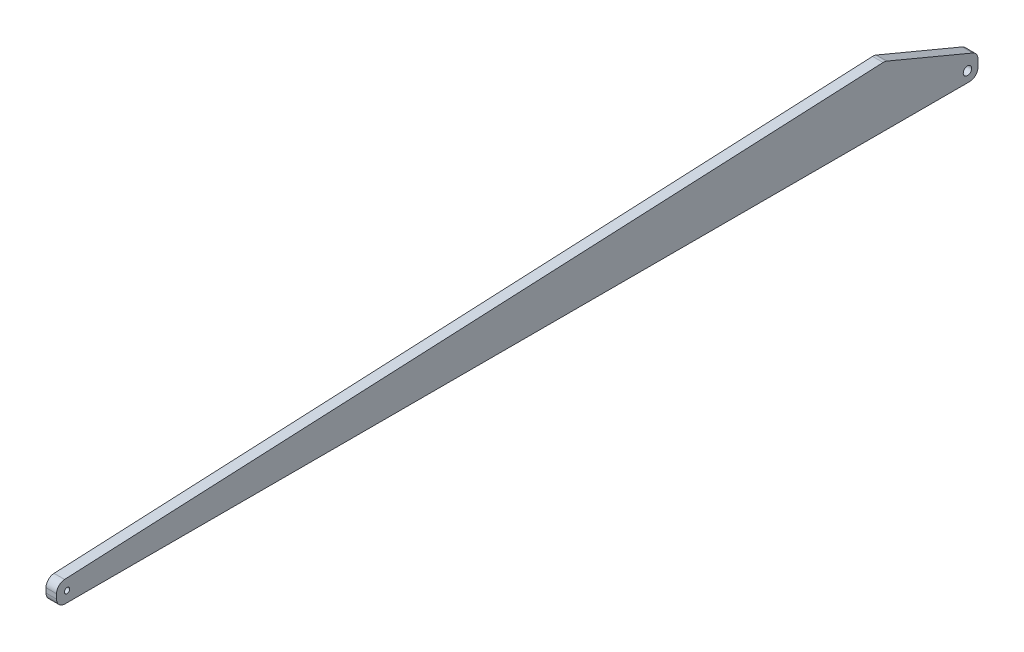
ISO-10303-21;
HEADER;
FILE_DESCRIPTION(('STEP AP214'),'2;1');
FILE_NAME('part.step','',(''),(''),'','','');
FILE_SCHEMA(('AUTOMOTIVE_DESIGN { 1 0 10303 214 1 1 1 1 }'));
ENDSEC;
DATA;
#1=APPLICATION_CONTEXT('core data for automotive mechanical design processes');
#2=APPLICATION_PROTOCOL_DEFINITION('international standard','automotive_design',2000,#1);
#3=PRODUCT_CONTEXT('',#1,'mechanical');
#4=PRODUCT('Part','Part','',(#3));
#5=PRODUCT_RELATED_PRODUCT_CATEGORY('part','',(#4));
#6=PRODUCT_DEFINITION_FORMATION('','',#4);
#7=PRODUCT_DEFINITION_CONTEXT('part definition',#1,'design');
#8=PRODUCT_DEFINITION('design','',#6,#7);
#9=PRODUCT_DEFINITION_SHAPE('','',#8);
#10=(LENGTH_UNIT() NAMED_UNIT(*) SI_UNIT(.MILLI.,.METRE.));
#11=(NAMED_UNIT(*) PLANE_ANGLE_UNIT() SI_UNIT($,.RADIAN.));
#12=(NAMED_UNIT(*) SI_UNIT($,.STERADIAN.) SOLID_ANGLE_UNIT());
#13=UNCERTAINTY_MEASURE_WITH_UNIT(LENGTH_MEASURE(1.E-05),#10,'distance_accuracy_value','');
#14=(GEOMETRIC_REPRESENTATION_CONTEXT(3) GLOBAL_UNCERTAINTY_ASSIGNED_CONTEXT((#13)) GLOBAL_UNIT_ASSIGNED_CONTEXT((#10,
#11,#12)) REPRESENTATION_CONTEXT('',''));
#15=CARTESIAN_POINT('',(0.,0.,0.));
#16=DIRECTION('',(0.,0.,1.));
#17=DIRECTION('',(1.,0.,0.));
#18=AXIS2_PLACEMENT_3D('',#15,#16,#17);
#19=CARTESIAN_POINT('',(6.35,0.,0.));
#20=DIRECTION('',(1.,0.,0.));
#21=DIRECTION('',(0.,0.,-1.));
#22=AXIS2_PLACEMENT_3D('',#19,#20,#21);
#23=PLANE('',#22);
#24=CARTESIAN_POINT('',(6.35,6.35,271.399));
#25=DIRECTION('',(1.,0.,0.));
#26=DIRECTION('',(0.,0.,-1.));
#27=AXIS2_PLACEMENT_3D('',#24,#25,#26);
#28=CIRCLE('',#27,1.60020000000001);
#29=CARTESIAN_POINT('',(6.35,6.35,269.7988));
#30=VERTEX_POINT('',#29);
#31=EDGE_CURVE('E154',#30,#30,#28,.T.);
#32=ORIENTED_EDGE('',*,*,#31,.F.);
#33=EDGE_LOOP('',(#32));
#34=FACE_BOUND('',#33,.T.);
#35=DIRECTION('',(0.,0.,-1.));
#36=VECTOR('',#35,1.);
#37=CARTESIAN_POINT('',(6.35,0.,-265.049));
#38=LINE('',#37,#36);
#39=CARTESIAN_POINT('',(6.35,4.21024326513475E-12,272.669));
#40=VERTEX_POINT('',#39);
#41=CARTESIAN_POINT('',(6.35,0.,-272.669));
#42=VERTEX_POINT('',#41);
#43=EDGE_CURVE('E177',#40,#42,#38,.T.);
#44=ORIENTED_EDGE('',*,*,#43,.T.);
#45=CARTESIAN_POINT('',(6.35,5.0800000000001,-272.669));
#46=DIRECTION('',(1.,0.,0.));
#47=DIRECTION('',(0.,0.,-1.));
#48=AXIS2_PLACEMENT_3D('',#45,#46,#47);
#49=CIRCLE('',#48,5.08);
#50=CARTESIAN_POINT('',(6.35,5.0800000000001,-277.749));
#51=VERTEX_POINT('',#50);
#52=EDGE_CURVE('E206',#42,#51,#49,.T.);
#53=ORIENTED_EDGE('',*,*,#52,.T.);
#54=DIRECTION('',(0.,1.,0.));
#55=VECTOR('',#54,1.);
#56=CARTESIAN_POINT('',(6.35,0.,-277.749));
#57=LINE('',#56,#55);
#58=CARTESIAN_POINT('',(6.35,9.31858027338978,-277.749));
#59=VERTEX_POINT('',#58);
#60=EDGE_CURVE('E144',#51,#59,#57,.T.);
#61=ORIENTED_EDGE('',*,*,#60,.T.);
#62=CARTESIAN_POINT('',(6.35,9.31858027338978,-272.669));
#63=DIRECTION('',(1.,0.,0.));
#64=DIRECTION('',(0.,0.,-1.));
#65=AXIS2_PLACEMENT_3D('',#62,#63,#64);
#66=CIRCLE('',#65,5.08);
#67=CARTESIAN_POINT('',(6.35,14.0050106830984,-274.629553497092));
#68=VERTEX_POINT('',#67);
#69=EDGE_CURVE('E203',#59,#68,#66,.T.);
#70=ORIENTED_EDGE('',*,*,#69,.T.);
#71=DIRECTION('',(0.,0.385935727773932,0.922525671202491));
#72=VECTOR('',#71,1.);
#73=CARTESIAN_POINT('',(6.35,36.1531263969552,-221.687563822674));
#74=LINE('',#73,#72);
#75=CARTESIAN_POINT('',(6.35,35.711468615602,-222.743285311677));
#76=VERTEX_POINT('',#75);
#77=EDGE_CURVE('E240',#68,#76,#74,.T.);
#78=ORIENTED_EDGE('',*,*,#77,.T.);
#79=CARTESIAN_POINT('',(6.35,31.0250382058933,-220.782731814585));
#80=DIRECTION('',(1.,0.,0.));
#81=DIRECTION('',(0.,0.,-1.));
#82=AXIS2_PLACEMENT_3D('',#79,#80,#81);
#83=CIRCLE('',#82,5.08);
#84=CARTESIAN_POINT('',(6.35,36.0994463368233,-220.544441821611));
#85=VERTEX_POINT('',#84);
#86=EDGE_CURVE('E200',#76,#85,#83,.T.);
#87=ORIENTED_EDGE('',*,*,#86,.T.);
#88=DIRECTION('',(0.,-0.0469074789319585,0.998899238372043));
#89=VECTOR('',#88,1.);
#90=CARTESIAN_POINT('',(6.35,12.7,277.749));
#91=LINE('',#90,#89);
#92=CARTESIAN_POINT('',(6.35,12.9273626822655,272.907289992974));
#93=VERTEX_POINT('',#92);
#94=EDGE_CURVE('E246',#85,#93,#91,.T.);
#95=ORIENTED_EDGE('',*,*,#94,.T.);
#96=CARTESIAN_POINT('',(6.35,7.85295455133549,272.669));
#97=DIRECTION('',(1.,0.,0.));
#98=DIRECTION('',(0.,0.,-1.));
#99=AXIS2_PLACEMENT_3D('',#96,#97,#98);
#100=CIRCLE('',#99,5.08);
#101=CARTESIAN_POINT('',(6.35,7.85295455133549,277.749));
#102=VERTEX_POINT('',#101);
#103=EDGE_CURVE('E66',#93,#102,#100,.T.);
#104=ORIENTED_EDGE('',*,*,#103,.T.);
#105=DIRECTION('',(0.,-1.,0.));
#106=VECTOR('',#105,1.);
#107=CARTESIAN_POINT('',(6.35,0.,277.749));
#108=LINE('',#107,#106);
#109=CARTESIAN_POINT('',(6.35,5.08,277.749));
#110=VERTEX_POINT('',#109);
#111=EDGE_CURVE('E165',#102,#110,#108,.T.);
#112=ORIENTED_EDGE('',*,*,#111,.T.);
#113=CARTESIAN_POINT('',(6.35,5.08,272.669));
#114=DIRECTION('',(1.,0.,0.));
#115=DIRECTION('',(0.,0.,-1.));
#116=AXIS2_PLACEMENT_3D('',#113,#114,#115);
#117=CIRCLE('',#116,5.08);
#118=EDGE_CURVE('E197',#110,#40,#117,.T.);
#119=ORIENTED_EDGE('',*,*,#118,.T.);
#120=EDGE_LOOP('',(#44,#53,#61,#70,#78,#87,#95,#104,#112,#119));
#121=FACE_BOUND('',#120,.T.);
#122=CARTESIAN_POINT('',(6.35,6.35,-271.399));
#123=DIRECTION('',(1.,0.,0.));
#124=DIRECTION('',(0.,0.,-1.));
#125=AXIS2_PLACEMENT_3D('',#122,#123,#124);
#126=CIRCLE('',#125,2.55270000000004);
#127=CARTESIAN_POINT('',(6.35,6.35,-273.9517));
#128=VERTEX_POINT('',#127);
#129=EDGE_CURVE('E256',#128,#128,#126,.T.);
#130=ORIENTED_EDGE('',*,*,#129,.F.);
#131=EDGE_LOOP('',(#130));
#132=FACE_BOUND('',#131,.T.);
#133=ADVANCED_FACE('F45',(#34,#121,#132),#23,.T.);
#134=CARTESIAN_POINT('',(0.,0.,0.));
#135=DIRECTION('',(1.,0.,0.));
#136=DIRECTION('',(0.,0.,-1.));
#137=AXIS2_PLACEMENT_3D('',#134,#135,#136);
#138=PLANE('',#137);
#139=DIRECTION('',(0.,1.,0.));
#140=VECTOR('',#139,1.);
#141=CARTESIAN_POINT('',(0.,0.,-277.749));
#142=LINE('',#141,#140);
#143=CARTESIAN_POINT('',(0.,5.0800000000001,-277.749));
#144=VERTEX_POINT('',#143);
#145=CARTESIAN_POINT('',(0.,9.31858027338978,-277.749));
#146=VERTEX_POINT('',#145);
#147=EDGE_CURVE('E141',#144,#146,#142,.T.);
#148=ORIENTED_EDGE('',*,*,#147,.F.);
#149=CARTESIAN_POINT('',(0.,5.0800000000001,-272.669));
#150=DIRECTION('',(1.,0.,0.));
#151=DIRECTION('',(0.,0.,-1.));
#152=AXIS2_PLACEMENT_3D('',#149,#150,#151);
#153=CIRCLE('',#152,5.08);
#154=CARTESIAN_POINT('',(0.,0.,-272.669));
#155=VERTEX_POINT('',#154);
#156=EDGE_CURVE('E123',#144,#155,#153,.F.);
#157=ORIENTED_EDGE('',*,*,#156,.T.);
#158=DIRECTION('',(0.,0.,-1.));
#159=VECTOR('',#158,1.);
#160=CARTESIAN_POINT('',(0.,0.,265.049));
#161=LINE('',#160,#159);
#162=CARTESIAN_POINT('',(0.,0.,272.669));
#163=VERTEX_POINT('',#162);
#164=EDGE_CURVE('E174',#163,#155,#161,.T.);
#165=ORIENTED_EDGE('',*,*,#164,.F.);
#166=CARTESIAN_POINT('',(0.,5.08,272.669));
#167=DIRECTION('',(1.,0.,0.));
#168=DIRECTION('',(0.,0.,-1.));
#169=AXIS2_PLACEMENT_3D('',#166,#167,#168);
#170=CIRCLE('',#169,5.08);
#171=CARTESIAN_POINT('',(0.,5.08,277.749));
#172=VERTEX_POINT('',#171);
#173=EDGE_CURVE('E182',#163,#172,#170,.F.);
#174=ORIENTED_EDGE('',*,*,#173,.T.);
#175=DIRECTION('',(0.,-1.,0.));
#176=VECTOR('',#175,1.);
#177=CARTESIAN_POINT('',(0.,0.,277.749));
#178=LINE('',#177,#176);
#179=CARTESIAN_POINT('',(0.,7.85295455133549,277.749));
#180=VERTEX_POINT('',#179);
#181=EDGE_CURVE('E171',#180,#172,#178,.T.);
#182=ORIENTED_EDGE('',*,*,#181,.F.);
#183=CARTESIAN_POINT('',(0.,7.85295455133549,272.669));
#184=DIRECTION('',(1.,0.,0.));
#185=DIRECTION('',(0.,0.,-1.));
#186=AXIS2_PLACEMENT_3D('',#183,#184,#185);
#187=CIRCLE('',#186,5.08);
#188=CARTESIAN_POINT('',(0.,12.9273626822655,272.907289992974));
#189=VERTEX_POINT('',#188);
#190=EDGE_CURVE('E146',#180,#189,#187,.F.);
#191=ORIENTED_EDGE('',*,*,#190,.T.);
#192=DIRECTION('',(0.,-0.0469074789319585,0.998899238372043));
#193=VECTOR('',#192,1.);
#194=CARTESIAN_POINT('',(0.,12.7,277.749));
#195=LINE('',#194,#193);
#196=CARTESIAN_POINT('',(0.,36.0994463368233,-220.544441821611));
#197=VERTEX_POINT('',#196);
#198=EDGE_CURVE('E159',#197,#189,#195,.T.);
#199=ORIENTED_EDGE('',*,*,#198,.F.);
#200=CARTESIAN_POINT('',(0.,31.0250382058933,-220.782731814585));
#201=DIRECTION('',(1.,0.,0.));
#202=DIRECTION('',(0.,0.,-1.));
#203=AXIS2_PLACEMENT_3D('',#200,#201,#202);
#204=CIRCLE('',#203,5.08);
#205=CARTESIAN_POINT('',(0.,35.711468615602,-222.743285311677));
#206=VERTEX_POINT('',#205);
#207=EDGE_CURVE('E185',#197,#206,#204,.F.);
#208=ORIENTED_EDGE('',*,*,#207,.T.);
#209=DIRECTION('',(0.,0.385935727773932,0.922525671202491));
#210=VECTOR('',#209,1.);
#211=CARTESIAN_POINT('',(0.,36.1531263969552,-221.687563822674));
#212=LINE('',#211,#210);
#213=CARTESIAN_POINT('',(0.,14.0050106830984,-274.629553497092));
#214=VERTEX_POINT('',#213);
#215=EDGE_CURVE('E153',#214,#206,#212,.T.);
#216=ORIENTED_EDGE('',*,*,#215,.F.);
#217=CARTESIAN_POINT('',(0.,9.31858027338978,-272.669));
#218=DIRECTION('',(1.,0.,0.));
#219=DIRECTION('',(0.,0.,-1.));
#220=AXIS2_PLACEMENT_3D('',#217,#218,#219);
#221=CIRCLE('',#220,5.08);
#222=EDGE_CURVE('E135',#214,#146,#221,.F.);
#223=ORIENTED_EDGE('',*,*,#222,.T.);
#224=EDGE_LOOP('',(#148,#157,#165,#174,#182,#191,#199,#208,#216,#223));
#225=FACE_BOUND('',#224,.T.);
#226=CARTESIAN_POINT('',(0.,6.35,271.399));
#227=DIRECTION('',(1.,0.,0.));
#228=DIRECTION('',(0.,0.,-1.));
#229=AXIS2_PLACEMENT_3D('',#226,#227,#228);
#230=CIRCLE('',#229,1.60020000000001);
#231=CARTESIAN_POINT('',(0.,6.35,269.7988));
#232=VERTEX_POINT('',#231);
#233=EDGE_CURVE('E162',#232,#232,#230,.T.);
#234=ORIENTED_EDGE('',*,*,#233,.T.);
#235=EDGE_LOOP('',(#234));
#236=FACE_BOUND('',#235,.T.);
#237=CARTESIAN_POINT('',(0.,6.35,-271.399));
#238=DIRECTION('',(1.,0.,0.));
#239=DIRECTION('',(0.,0.,-1.));
#240=AXIS2_PLACEMENT_3D('',#237,#238,#239);
#241=CIRCLE('',#240,2.55270000000004);
#242=CARTESIAN_POINT('',(0.,6.35,-273.9517));
#243=VERTEX_POINT('',#242);
#244=EDGE_CURVE('E259',#243,#243,#241,.T.);
#245=ORIENTED_EDGE('',*,*,#244,.T.);
#246=EDGE_LOOP('',(#245));
#247=FACE_BOUND('',#246,.T.);
#248=ADVANCED_FACE('F149',(#225,#236,#247),#138,.F.);
#249=CARTESIAN_POINT('',(6.35,0.,-277.749));
#250=DIRECTION('',(0.,0.,1.));
#251=DIRECTION('',(1.,0.,0.));
#252=AXIS2_PLACEMENT_3D('',#249,#250,#251);
#253=PLANE('',#252);
#254=ORIENTED_EDGE('',*,*,#60,.F.);
#255=DIRECTION('',(-1.,0.,0.));
#256=VECTOR('',#255,1.);
#257=CARTESIAN_POINT('',(6.35,5.0800000000001,-277.749));
#258=LINE('',#257,#256);
#259=EDGE_CURVE('E127',#51,#144,#258,.T.);
#260=ORIENTED_EDGE('',*,*,#259,.T.);
#261=ORIENTED_EDGE('',*,*,#147,.T.);
#262=DIRECTION('',(-1.,0.,0.));
#263=VECTOR('',#262,1.);
#264=CARTESIAN_POINT('',(6.35,9.31858027338978,-277.749));
#265=LINE('',#264,#263);
#266=EDGE_CURVE('E147',#146,#59,#265,.F.);
#267=ORIENTED_EDGE('',*,*,#266,.T.);
#268=EDGE_LOOP('',(#254,#260,#261,#267));
#269=FACE_BOUND('',#268,.T.);
#270=ADVANCED_FACE('F140',(#269),#253,.F.);
#271=CARTESIAN_POINT('',(6.35,36.1531263969552,-221.687563822674));
#272=DIRECTION('',(0.,-0.922525671202491,0.385935727773932));
#273=DIRECTION('',(0.,-0.385935727773932,-0.922525671202491));
#274=AXIS2_PLACEMENT_3D('',#271,#272,#273);
#275=PLANE('',#274);
#276=ORIENTED_EDGE('',*,*,#77,.F.);
#277=DIRECTION('',(-1.,0.,0.));
#278=VECTOR('',#277,1.);
#279=CARTESIAN_POINT('',(6.35,14.0050106830984,-274.629553497092));
#280=LINE('',#279,#278);
#281=EDGE_CURVE('E212',#68,#214,#280,.T.);
#282=ORIENTED_EDGE('',*,*,#281,.T.);
#283=ORIENTED_EDGE('',*,*,#215,.T.);
#284=DIRECTION('',(-1.,0.,0.));
#285=VECTOR('',#284,1.);
#286=CARTESIAN_POINT('',(6.35,35.711468615602,-222.743285311677));
#287=LINE('',#286,#285);
#288=EDGE_CURVE('E209',#206,#76,#287,.F.);
#289=ORIENTED_EDGE('',*,*,#288,.T.);
#290=EDGE_LOOP('',(#276,#282,#283,#289));
#291=FACE_BOUND('',#290,.T.);
#292=ADVANCED_FACE('F291',(#291),#275,.F.);
#293=CARTESIAN_POINT('',(6.35,12.7,277.749));
#294=DIRECTION('',(0.,-0.998899238372043,-0.0469074789319585));
#295=DIRECTION('',(0.,0.0469074789319585,-0.998899238372043));
#296=AXIS2_PLACEMENT_3D('',#293,#294,#295);
#297=PLANE('',#296);
#298=ORIENTED_EDGE('',*,*,#94,.F.);
#299=DIRECTION('',(-1.,0.,0.));
#300=VECTOR('',#299,1.);
#301=CARTESIAN_POINT('',(6.35,36.0994463368233,-220.544441821611));
#302=LINE('',#301,#300);
#303=EDGE_CURVE('E219',#85,#197,#302,.T.);
#304=ORIENTED_EDGE('',*,*,#303,.T.);
#305=ORIENTED_EDGE('',*,*,#198,.T.);
#306=DIRECTION('',(-1.,0.,0.));
#307=VECTOR('',#306,1.);
#308=CARTESIAN_POINT('',(6.35,12.9273626822655,272.907289992974));
#309=LINE('',#308,#307);
#310=EDGE_CURVE('E216',#189,#93,#309,.F.);
#311=ORIENTED_EDGE('',*,*,#310,.T.);
#312=EDGE_LOOP('',(#298,#304,#305,#311));
#313=FACE_BOUND('',#312,.T.);
#314=ADVANCED_FACE('F288',(#313),#297,.F.);
#315=CARTESIAN_POINT('',(6.35,0.,277.749));
#316=DIRECTION('',(0.,0.,-1.));
#317=DIRECTION('',(-1.,0.,0.));
#318=AXIS2_PLACEMENT_3D('',#315,#316,#317);
#319=PLANE('',#318);
#320=ORIENTED_EDGE('',*,*,#181,.T.);
#321=DIRECTION('',(-1.,0.,0.));
#322=VECTOR('',#321,1.);
#323=CARTESIAN_POINT('',(6.35,5.08,277.749));
#324=LINE('',#323,#322);
#325=EDGE_CURVE('E11',#172,#110,#324,.F.);
#326=ORIENTED_EDGE('',*,*,#325,.T.);
#327=ORIENTED_EDGE('',*,*,#111,.F.);
#328=DIRECTION('',(-1.,0.,0.));
#329=VECTOR('',#328,1.);
#330=CARTESIAN_POINT('',(6.35,7.85295455133549,277.749));
#331=LINE('',#330,#329);
#332=EDGE_CURVE('E54',#102,#180,#331,.T.);
#333=ORIENTED_EDGE('',*,*,#332,.T.);
#334=EDGE_LOOP('',(#320,#326,#327,#333));
#335=FACE_BOUND('',#334,.T.);
#336=ADVANCED_FACE('F226',(#335),#319,.F.);
#337=CARTESIAN_POINT('',(6.35,0.,265.049));
#338=DIRECTION('',(0.,1.,0.));
#339=DIRECTION('',(0.,0.,1.));
#340=AXIS2_PLACEMENT_3D('',#337,#338,#339);
#341=PLANE('',#340);
#342=ORIENTED_EDGE('',*,*,#164,.T.);
#343=DIRECTION('',(-1.,0.,0.));
#344=VECTOR('',#343,1.);
#345=CARTESIAN_POINT('',(6.35,0.,-272.669));
#346=LINE('',#345,#344);
#347=EDGE_CURVE('E128',#155,#42,#346,.F.);
#348=ORIENTED_EDGE('',*,*,#347,.T.);
#349=ORIENTED_EDGE('',*,*,#43,.F.);
#350=DIRECTION('',(-1.,0.,0.));
#351=VECTOR('',#350,1.);
#352=CARTESIAN_POINT('',(6.35,0.,272.669));
#353=LINE('',#352,#351);
#354=EDGE_CURVE('E134',#40,#163,#353,.T.);
#355=ORIENTED_EDGE('',*,*,#354,.T.);
#356=EDGE_LOOP('',(#342,#348,#349,#355));
#357=FACE_BOUND('',#356,.T.);
#358=ADVANCED_FACE('F235',(#357),#341,.F.);
#359=CARTESIAN_POINT('',(6.35,6.35,271.399));
#360=DIRECTION('',(-1.,0.,0.));
#361=DIRECTION('',(0.,0.,1.));
#362=AXIS2_PLACEMENT_3D('',#359,#360,#361);
#363=CYLINDRICAL_SURFACE('',#362,1.60020000000001);
#364=ORIENTED_EDGE('',*,*,#31,.T.);
#365=EDGE_LOOP('',(#364));
#366=FACE_BOUND('',#365,.T.);
#367=ORIENTED_EDGE('',*,*,#233,.F.);
#368=EDGE_LOOP('',(#367));
#369=FACE_BOUND('',#368,.T.);
#370=ADVANCED_FACE('F271',(#366,#369),#363,.F.);
#371=CARTESIAN_POINT('',(6.35,6.35,-271.399));
#372=DIRECTION('',(-1.,0.,0.));
#373=DIRECTION('',(0.,0.,1.));
#374=AXIS2_PLACEMENT_3D('',#371,#372,#373);
#375=CYLINDRICAL_SURFACE('',#374,2.55270000000004);
#376=ORIENTED_EDGE('',*,*,#129,.T.);
#377=EDGE_LOOP('',(#376));
#378=FACE_BOUND('',#377,.T.);
#379=ORIENTED_EDGE('',*,*,#244,.F.);
#380=EDGE_LOOP('',(#379));
#381=FACE_BOUND('',#380,.T.);
#382=ADVANCED_FACE('F269',(#378,#381),#375,.F.);
#383=CARTESIAN_POINT('',(6.35,5.0800000000001,-272.669));
#384=DIRECTION('',(-1.,0.,0.));
#385=DIRECTION('',(0.,0.,1.));
#386=AXIS2_PLACEMENT_3D('',#383,#384,#385);
#387=CYLINDRICAL_SURFACE('',#386,5.08);
#388=ORIENTED_EDGE('',*,*,#52,.F.);
#389=ORIENTED_EDGE('',*,*,#347,.F.);
#390=ORIENTED_EDGE('',*,*,#156,.F.);
#391=ORIENTED_EDGE('',*,*,#259,.F.);
#392=EDGE_LOOP('',(#388,#389,#390,#391));
#393=FACE_BOUND('',#392,.T.);
#394=ADVANCED_FACE('F126',(#393),#387,.T.);
#395=CARTESIAN_POINT('',(6.35,9.31858027338978,-272.669));
#396=DIRECTION('',(-1.,0.,0.));
#397=DIRECTION('',(0.,0.,1.));
#398=AXIS2_PLACEMENT_3D('',#395,#396,#397);
#399=CYLINDRICAL_SURFACE('',#398,5.08);
#400=ORIENTED_EDGE('',*,*,#69,.F.);
#401=ORIENTED_EDGE('',*,*,#266,.F.);
#402=ORIENTED_EDGE('',*,*,#222,.F.);
#403=ORIENTED_EDGE('',*,*,#281,.F.);
#404=EDGE_LOOP('',(#400,#401,#402,#403));
#405=FACE_BOUND('',#404,.T.);
#406=ADVANCED_FACE('F277',(#405),#399,.T.);
#407=CARTESIAN_POINT('',(6.35,31.0250382058933,-220.782731814585));
#408=DIRECTION('',(-1.,0.,0.));
#409=DIRECTION('',(0.,0.,1.));
#410=AXIS2_PLACEMENT_3D('',#407,#408,#409);
#411=CYLINDRICAL_SURFACE('',#410,5.08);
#412=ORIENTED_EDGE('',*,*,#86,.F.);
#413=ORIENTED_EDGE('',*,*,#288,.F.);
#414=ORIENTED_EDGE('',*,*,#207,.F.);
#415=ORIENTED_EDGE('',*,*,#303,.F.);
#416=EDGE_LOOP('',(#412,#413,#414,#415));
#417=FACE_BOUND('',#416,.T.);
#418=ADVANCED_FACE('F300',(#417),#411,.T.);
#419=CARTESIAN_POINT('',(6.35,5.08,272.669));
#420=DIRECTION('',(-1.,0.,0.));
#421=DIRECTION('',(0.,0.,1.));
#422=AXIS2_PLACEMENT_3D('',#419,#420,#421);
#423=CYLINDRICAL_SURFACE('',#422,5.08);
#424=ORIENTED_EDGE('',*,*,#118,.F.);
#425=ORIENTED_EDGE('',*,*,#325,.F.);
#426=ORIENTED_EDGE('',*,*,#173,.F.);
#427=ORIENTED_EDGE('',*,*,#354,.F.);
#428=EDGE_LOOP('',(#424,#425,#426,#427));
#429=FACE_BOUND('',#428,.T.);
#430=ADVANCED_FACE('F232',(#429),#423,.T.);
#431=CARTESIAN_POINT('',(6.35,7.85295455133549,272.669));
#432=DIRECTION('',(-1.,0.,0.));
#433=DIRECTION('',(0.,0.,1.));
#434=AXIS2_PLACEMENT_3D('',#431,#432,#433);
#435=CYLINDRICAL_SURFACE('',#434,5.08);
#436=ORIENTED_EDGE('',*,*,#103,.F.);
#437=ORIENTED_EDGE('',*,*,#310,.F.);
#438=ORIENTED_EDGE('',*,*,#190,.F.);
#439=ORIENTED_EDGE('',*,*,#332,.F.);
#440=EDGE_LOOP('',(#436,#437,#438,#439));
#441=FACE_BOUND('',#440,.T.);
#442=ADVANCED_FACE('F47',(#441),#435,.T.);
#443=CLOSED_SHELL('',(#133,#248,#270,#292,#314,#336,#358,#370,#382,#394,#406,#418,#430,#442));
#444=MANIFOLD_SOLID_BREP('B2',#443);
#445=ADVANCED_BREP_SHAPE_REPRESENTATION('',(#18,#444),#14);
#446=SHAPE_DEFINITION_REPRESENTATION(#9,#445);
ENDSEC;
END-ISO-10303-21;
